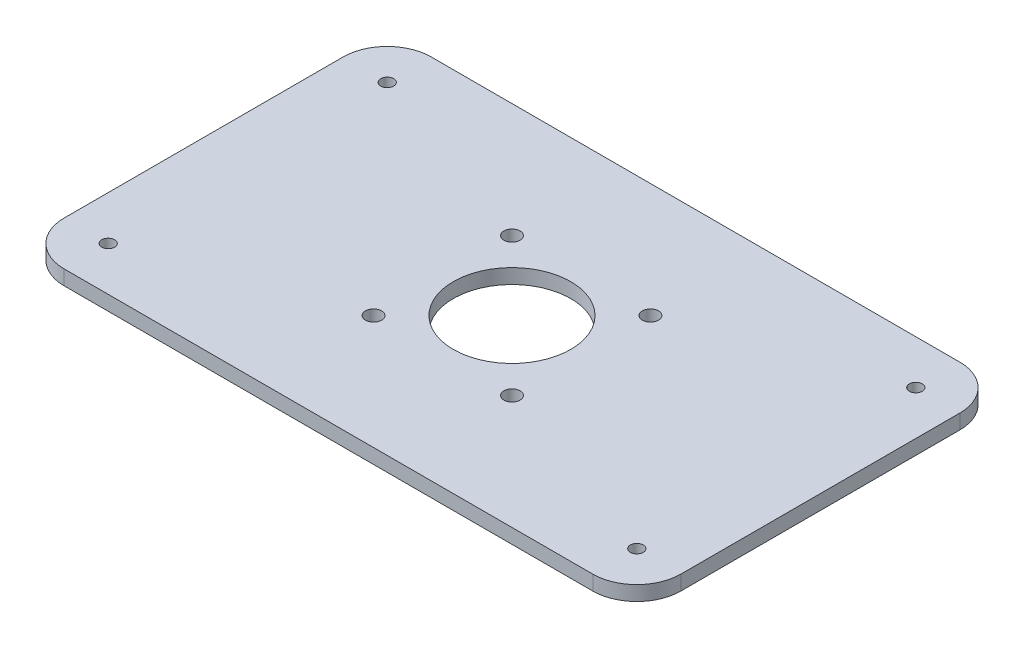
ISO-10303-21;
HEADER;
FILE_DESCRIPTION(('STEP AP214'),'2;1');
FILE_NAME('part.step','',(''),(''),'','','');
FILE_SCHEMA(('AUTOMOTIVE_DESIGN { 1 0 10303 214 1 1 1 1 }'));
ENDSEC;
DATA;
#1=APPLICATION_CONTEXT('core data for automotive mechanical design processes');
#2=APPLICATION_PROTOCOL_DEFINITION('international standard','automotive_design',2000,#1);
#3=PRODUCT_CONTEXT('',#1,'mechanical');
#4=PRODUCT('Part','Part','',(#3));
#5=PRODUCT_RELATED_PRODUCT_CATEGORY('part','',(#4));
#6=PRODUCT_DEFINITION_FORMATION('','',#4);
#7=PRODUCT_DEFINITION_CONTEXT('part definition',#1,'design');
#8=PRODUCT_DEFINITION('design','',#6,#7);
#9=PRODUCT_DEFINITION_SHAPE('','',#8);
#10=(LENGTH_UNIT() NAMED_UNIT(*) SI_UNIT(.MILLI.,.METRE.));
#11=(NAMED_UNIT(*) PLANE_ANGLE_UNIT() SI_UNIT($,.RADIAN.));
#12=(NAMED_UNIT(*) SI_UNIT($,.STERADIAN.) SOLID_ANGLE_UNIT());
#13=UNCERTAINTY_MEASURE_WITH_UNIT(LENGTH_MEASURE(1.E-05),#10,'distance_accuracy_value','');
#14=(GEOMETRIC_REPRESENTATION_CONTEXT(3) GLOBAL_UNCERTAINTY_ASSIGNED_CONTEXT((#13)) GLOBAL_UNIT_ASSIGNED_CONTEXT((#10,
#11,#12)) REPRESENTATION_CONTEXT('',''));
#15=CARTESIAN_POINT('',(0.,0.,0.));
#16=DIRECTION('',(0.,0.,1.));
#17=DIRECTION('',(1.,0.,0.));
#18=AXIS2_PLACEMENT_3D('',#15,#16,#17);
#19=CARTESIAN_POINT('',(0.,5.,0.));
#20=DIRECTION('',(0.,1.,0.));
#21=DIRECTION('',(0.,0.,1.));
#22=AXIS2_PLACEMENT_3D('',#19,#20,#21);
#23=PLANE('',#22);
#24=CARTESIAN_POINT('',(-23.5700000000002,5.,23.5699999999998));
#25=DIRECTION('',(0.,1.,0.));
#26=DIRECTION('',(0.,0.,1.));
#27=AXIS2_PLACEMENT_3D('',#24,#25,#26);
#28=CIRCLE('',#27,2.75);
#29=CARTESIAN_POINT('',(-23.5700000000002,5.,26.3199999999998));
#30=VERTEX_POINT('',#29);
#31=EDGE_CURVE('E320',#30,#30,#28,.T.);
#32=ORIENTED_EDGE('',*,*,#31,.F.);
#33=EDGE_LOOP('',(#32));
#34=FACE_BOUND('',#33,.T.);
#35=CARTESIAN_POINT('',(23.5699999999998,5.,23.5700000000002));
#36=DIRECTION('',(0.,1.,0.));
#37=DIRECTION('',(0.,0.,1.));
#38=AXIS2_PLACEMENT_3D('',#35,#36,#37);
#39=CIRCLE('',#38,2.75);
#40=CARTESIAN_POINT('',(23.5699999999998,5.,26.3200000000002));
#41=VERTEX_POINT('',#40);
#42=EDGE_CURVE('E323',#41,#41,#39,.T.);
#43=ORIENTED_EDGE('',*,*,#42,.F.);
#44=EDGE_LOOP('',(#43));
#45=FACE_BOUND('',#44,.T.);
#46=CARTESIAN_POINT('',(23.5700000000001,5.,-23.5699999999999));
#47=DIRECTION('',(0.,1.,0.));
#48=DIRECTION('',(0.,0.,1.));
#49=AXIS2_PLACEMENT_3D('',#46,#47,#48);
#50=CIRCLE('',#49,2.75);
#51=CARTESIAN_POINT('',(23.5700000000001,5.,-20.8199999999999));
#52=VERTEX_POINT('',#51);
#53=EDGE_CURVE('E289',#52,#52,#50,.T.);
#54=ORIENTED_EDGE('',*,*,#53,.F.);
#55=EDGE_LOOP('',(#54));
#56=FACE_BOUND('',#55,.T.);
#57=CARTESIAN_POINT('',(-23.57,5.,-23.57));
#58=DIRECTION('',(0.,1.,0.));
#59=DIRECTION('',(0.,0.,1.));
#60=AXIS2_PLACEMENT_3D('',#57,#58,#59);
#61=CIRCLE('',#60,2.75);
#62=CARTESIAN_POINT('',(-23.57,5.,-20.82));
#63=VERTEX_POINT('',#62);
#64=EDGE_CURVE('E175',#63,#63,#61,.T.);
#65=ORIENTED_EDGE('',*,*,#64,.F.);
#66=EDGE_LOOP('',(#65));
#67=FACE_BOUND('',#66,.T.);
#68=CARTESIAN_POINT('',(-90.,5.,47.5));
#69=DIRECTION('',(0.,1.,0.));
#70=DIRECTION('',(0.,0.,-1.));
#71=AXIS2_PLACEMENT_3D('',#68,#69,#70);
#72=CIRCLE('',#71,2.20000000000521);
#73=CARTESIAN_POINT('',(-90.,5.,45.2999999999948));
#74=VERTEX_POINT('',#73);
#75=EDGE_CURVE('E186',#74,#74,#72,.T.);
#76=ORIENTED_EDGE('',*,*,#75,.F.);
#77=EDGE_LOOP('',(#76));
#78=FACE_BOUND('',#77,.T.);
#79=CARTESIAN_POINT('',(90.0000000000001,5.,47.5));
#80=DIRECTION('',(0.,1.,0.));
#81=DIRECTION('',(0.,0.,1.));
#82=AXIS2_PLACEMENT_3D('',#79,#80,#81);
#83=CIRCLE('',#82,2.20000000000521);
#84=CARTESIAN_POINT('',(90.0000000000001,5.,49.7000000000053));
#85=VERTEX_POINT('',#84);
#86=EDGE_CURVE('E311',#85,#85,#83,.T.);
#87=ORIENTED_EDGE('',*,*,#86,.F.);
#88=EDGE_LOOP('',(#87));
#89=FACE_BOUND('',#88,.T.);
#90=CARTESIAN_POINT('',(90.0000000000001,5.,-47.5));
#91=DIRECTION('',(0.,1.,0.));
#92=DIRECTION('',(0.,0.,-1.));
#93=AXIS2_PLACEMENT_3D('',#90,#91,#92);
#94=CIRCLE('',#93,2.20000000000521);
#95=CARTESIAN_POINT('',(90.0000000000001,5.,-49.7000000000053));
#96=VERTEX_POINT('',#95);
#97=EDGE_CURVE('E200',#96,#96,#94,.T.);
#98=ORIENTED_EDGE('',*,*,#97,.F.);
#99=EDGE_LOOP('',(#98));
#100=FACE_BOUND('',#99,.T.);
#101=CARTESIAN_POINT('',(-90.,5.,-47.5));
#102=DIRECTION('',(0.,1.,0.));
#103=DIRECTION('',(0.,0.,1.));
#104=AXIS2_PLACEMENT_3D('',#101,#102,#103);
#105=CIRCLE('',#104,2.20000000000521);
#106=CARTESIAN_POINT('',(-90.,5.,-45.2999999999948));
#107=VERTEX_POINT('',#106);
#108=EDGE_CURVE('E197',#107,#107,#105,.T.);
#109=ORIENTED_EDGE('',*,*,#108,.F.);
#110=EDGE_LOOP('',(#109));
#111=FACE_BOUND('',#110,.T.);
#112=CARTESIAN_POINT('',(0.,5.,0.));
#113=DIRECTION('',(0.,1.,0.));
#114=DIRECTION('',(0.,0.,1.));
#115=AXIS2_PLACEMENT_3D('',#112,#113,#114);
#116=CIRCLE('',#115,20.);
#117=CARTESIAN_POINT('',(0.,5.,20.));
#118=VERTEX_POINT('',#117);
#119=EDGE_CURVE('E143',#118,#118,#116,.T.);
#120=ORIENTED_EDGE('',*,*,#119,.F.);
#121=EDGE_LOOP('',(#120));
#122=FACE_BOUND('',#121,.T.);
#123=DIRECTION('',(0.,0.,1.));
#124=VECTOR('',#123,1.);
#125=CARTESIAN_POINT('',(-105.,5.,-62.5));
#126=LINE('',#125,#124);
#127=CARTESIAN_POINT('',(-105.,5.,-47.5));
#128=VERTEX_POINT('',#127);
#129=CARTESIAN_POINT('',(-105.,5.,47.5));
#130=VERTEX_POINT('',#129);
#131=EDGE_CURVE('E142',#128,#130,#126,.T.);
#132=ORIENTED_EDGE('',*,*,#131,.T.);
#133=CARTESIAN_POINT('',(-90.,5.,47.5));
#134=DIRECTION('',(0.,1.,0.));
#135=DIRECTION('',(0.,0.,1.));
#136=AXIS2_PLACEMENT_3D('',#133,#134,#135);
#137=CIRCLE('',#136,15.);
#138=CARTESIAN_POINT('',(-90.,5.,62.5));
#139=VERTEX_POINT('',#138);
#140=EDGE_CURVE('E163',#130,#139,#137,.T.);
#141=ORIENTED_EDGE('',*,*,#140,.T.);
#142=DIRECTION('',(1.,0.,0.));
#143=VECTOR('',#142,1.);
#144=CARTESIAN_POINT('',(-105.,5.,62.5));
#145=LINE('',#144,#143);
#146=CARTESIAN_POINT('',(90.,5.,62.5));
#147=VERTEX_POINT('',#146);
#148=EDGE_CURVE('E125',#139,#147,#145,.T.);
#149=ORIENTED_EDGE('',*,*,#148,.T.);
#150=CARTESIAN_POINT('',(90.,5.,47.5));
#151=DIRECTION('',(0.,1.,0.));
#152=DIRECTION('',(0.,0.,1.));
#153=AXIS2_PLACEMENT_3D('',#150,#151,#152);
#154=CIRCLE('',#153,15.);
#155=CARTESIAN_POINT('',(105.,5.,47.5));
#156=VERTEX_POINT('',#155);
#157=EDGE_CURVE('E161',#147,#156,#154,.T.);
#158=ORIENTED_EDGE('',*,*,#157,.T.);
#159=DIRECTION('',(0.,0.,-1.));
#160=VECTOR('',#159,1.);
#161=CARTESIAN_POINT('',(105.,5.,-62.5));
#162=LINE('',#161,#160);
#163=CARTESIAN_POINT('',(105.,5.,-47.5));
#164=VERTEX_POINT('',#163);
#165=EDGE_CURVE('E204',#156,#164,#162,.T.);
#166=ORIENTED_EDGE('',*,*,#165,.T.);
#167=CARTESIAN_POINT('',(90.,5.,-47.5));
#168=DIRECTION('',(0.,1.,0.));
#169=DIRECTION('',(0.,0.,1.));
#170=AXIS2_PLACEMENT_3D('',#167,#168,#169);
#171=CIRCLE('',#170,15.);
#172=CARTESIAN_POINT('',(90.,5.,-62.5));
#173=VERTEX_POINT('',#172);
#174=EDGE_CURVE('E60',#164,#173,#171,.T.);
#175=ORIENTED_EDGE('',*,*,#174,.T.);
#176=DIRECTION('',(-1.,0.,0.));
#177=VECTOR('',#176,1.);
#178=CARTESIAN_POINT('',(-105.,5.,-62.5));
#179=LINE('',#178,#177);
#180=CARTESIAN_POINT('',(-90.,5.,-62.5));
#181=VERTEX_POINT('',#180);
#182=EDGE_CURVE('E149',#173,#181,#179,.T.);
#183=ORIENTED_EDGE('',*,*,#182,.T.);
#184=CARTESIAN_POINT('',(-90.,5.,-47.5));
#185=DIRECTION('',(0.,1.,0.));
#186=DIRECTION('',(0.,0.,1.));
#187=AXIS2_PLACEMENT_3D('',#184,#185,#186);
#188=CIRCLE('',#187,15.);
#189=EDGE_CURVE('E158',#181,#128,#188,.T.);
#190=ORIENTED_EDGE('',*,*,#189,.T.);
#191=EDGE_LOOP('',(#132,#141,#149,#158,#166,#175,#183,#190));
#192=FACE_BOUND('',#191,.T.);
#193=ADVANCED_FACE('F37',(#34,#45,#56,#67,#78,#89,#100,#111,#122,#192),#23,.T.);
#194=CARTESIAN_POINT('',(0.,0.,0.));
#195=DIRECTION('',(0.,1.,0.));
#196=DIRECTION('',(0.,0.,1.));
#197=AXIS2_PLACEMENT_3D('',#194,#195,#196);
#198=PLANE('',#197);
#199=CARTESIAN_POINT('',(-23.5700000000002,0.,23.5699999999998));
#200=DIRECTION('',(0.,1.,0.));
#201=DIRECTION('',(0.,0.,1.));
#202=AXIS2_PLACEMENT_3D('',#199,#200,#201);
#203=CIRCLE('',#202,2.75);
#204=CARTESIAN_POINT('',(-23.5700000000002,0.,26.3199999999998));
#205=VERTEX_POINT('',#204);
#206=EDGE_CURVE('E41',#205,#205,#203,.T.);
#207=ORIENTED_EDGE('',*,*,#206,.T.);
#208=EDGE_LOOP('',(#207));
#209=FACE_BOUND('',#208,.T.);
#210=CARTESIAN_POINT('',(23.5699999999998,0.,23.5700000000002));
#211=DIRECTION('',(0.,1.,0.));
#212=DIRECTION('',(0.,0.,1.));
#213=AXIS2_PLACEMENT_3D('',#210,#211,#212);
#214=CIRCLE('',#213,2.75);
#215=CARTESIAN_POINT('',(23.5699999999998,0.,26.3200000000002));
#216=VERTEX_POINT('',#215);
#217=EDGE_CURVE('E177',#216,#216,#214,.T.);
#218=ORIENTED_EDGE('',*,*,#217,.T.);
#219=EDGE_LOOP('',(#218));
#220=FACE_BOUND('',#219,.T.);
#221=CARTESIAN_POINT('',(23.5700000000001,0.,-23.5699999999999));
#222=DIRECTION('',(0.,1.,0.));
#223=DIRECTION('',(0.,0.,1.));
#224=AXIS2_PLACEMENT_3D('',#221,#222,#223);
#225=CIRCLE('',#224,2.75);
#226=CARTESIAN_POINT('',(23.5700000000001,0.,-20.8199999999999));
#227=VERTEX_POINT('',#226);
#228=EDGE_CURVE('E174',#227,#227,#225,.T.);
#229=ORIENTED_EDGE('',*,*,#228,.T.);
#230=EDGE_LOOP('',(#229));
#231=FACE_BOUND('',#230,.T.);
#232=CARTESIAN_POINT('',(-23.57,0.,-23.57));
#233=DIRECTION('',(0.,1.,0.));
#234=DIRECTION('',(0.,0.,1.));
#235=AXIS2_PLACEMENT_3D('',#232,#233,#234);
#236=CIRCLE('',#235,2.75);
#237=CARTESIAN_POINT('',(-23.57,0.,-20.82));
#238=VERTEX_POINT('',#237);
#239=EDGE_CURVE('E171',#238,#238,#236,.T.);
#240=ORIENTED_EDGE('',*,*,#239,.T.);
#241=EDGE_LOOP('',(#240));
#242=FACE_BOUND('',#241,.T.);
#243=CARTESIAN_POINT('',(-90.,0.,47.5));
#244=DIRECTION('',(0.,1.,0.));
#245=DIRECTION('',(0.,0.,-1.));
#246=AXIS2_PLACEMENT_3D('',#243,#244,#245);
#247=CIRCLE('',#246,2.20000000000521);
#248=CARTESIAN_POINT('',(-90.,0.,45.2999999999948));
#249=VERTEX_POINT('',#248);
#250=EDGE_CURVE('E182',#249,#249,#247,.T.);
#251=ORIENTED_EDGE('',*,*,#250,.T.);
#252=EDGE_LOOP('',(#251));
#253=FACE_BOUND('',#252,.T.);
#254=CARTESIAN_POINT('',(90.0000000000001,0.,47.5));
#255=DIRECTION('',(0.,1.,0.));
#256=DIRECTION('',(0.,0.,1.));
#257=AXIS2_PLACEMENT_3D('',#254,#255,#256);
#258=CIRCLE('',#257,2.20000000000521);
#259=CARTESIAN_POINT('',(90.0000000000001,0.,49.7000000000053));
#260=VERTEX_POINT('',#259);
#261=EDGE_CURVE('E191',#260,#260,#258,.T.);
#262=ORIENTED_EDGE('',*,*,#261,.T.);
#263=EDGE_LOOP('',(#262));
#264=FACE_BOUND('',#263,.T.);
#265=CARTESIAN_POINT('',(90.0000000000001,0.,-47.5));
#266=DIRECTION('',(0.,1.,0.));
#267=DIRECTION('',(0.,0.,-1.));
#268=AXIS2_PLACEMENT_3D('',#265,#266,#267);
#269=CIRCLE('',#268,2.20000000000521);
#270=CARTESIAN_POINT('',(90.0000000000001,0.,-49.7000000000053));
#271=VERTEX_POINT('',#270);
#272=EDGE_CURVE('E301',#271,#271,#269,.T.);
#273=ORIENTED_EDGE('',*,*,#272,.T.);
#274=EDGE_LOOP('',(#273));
#275=FACE_BOUND('',#274,.T.);
#276=CARTESIAN_POINT('',(-90.,0.,-47.5));
#277=DIRECTION('',(0.,1.,0.));
#278=DIRECTION('',(0.,0.,1.));
#279=AXIS2_PLACEMENT_3D('',#276,#277,#278);
#280=CIRCLE('',#279,2.20000000000521);
#281=CARTESIAN_POINT('',(-90.,0.,-45.2999999999948));
#282=VERTEX_POINT('',#281);
#283=EDGE_CURVE('E137',#282,#282,#280,.T.);
#284=ORIENTED_EDGE('',*,*,#283,.T.);
#285=EDGE_LOOP('',(#284));
#286=FACE_BOUND('',#285,.T.);
#287=CARTESIAN_POINT('',(0.,0.,0.));
#288=DIRECTION('',(0.,1.,0.));
#289=DIRECTION('',(0.,0.,1.));
#290=AXIS2_PLACEMENT_3D('',#287,#288,#289);
#291=CIRCLE('',#290,20.);
#292=CARTESIAN_POINT('',(0.,0.,20.));
#293=VERTEX_POINT('',#292);
#294=EDGE_CURVE('E146',#293,#293,#291,.T.);
#295=ORIENTED_EDGE('',*,*,#294,.T.);
#296=EDGE_LOOP('',(#295));
#297=FACE_BOUND('',#296,.T.);
#298=DIRECTION('',(1.,0.,0.));
#299=VECTOR('',#298,1.);
#300=CARTESIAN_POINT('',(-105.,0.,62.5));
#301=LINE('',#300,#299);
#302=CARTESIAN_POINT('',(-90.,0.,62.5));
#303=VERTEX_POINT('',#302);
#304=CARTESIAN_POINT('',(90.,0.,62.5));
#305=VERTEX_POINT('',#304);
#306=EDGE_CURVE('E122',#303,#305,#301,.T.);
#307=ORIENTED_EDGE('',*,*,#306,.F.);
#308=CARTESIAN_POINT('',(-90.,0.,47.5));
#309=DIRECTION('',(0.,1.,0.));
#310=DIRECTION('',(0.,0.,1.));
#311=AXIS2_PLACEMENT_3D('',#308,#309,#310);
#312=CIRCLE('',#311,15.);
#313=CARTESIAN_POINT('',(-105.,0.,47.5));
#314=VERTEX_POINT('',#313);
#315=EDGE_CURVE('E105',#303,#314,#312,.F.);
#316=ORIENTED_EDGE('',*,*,#315,.T.);
#317=DIRECTION('',(0.,0.,1.));
#318=VECTOR('',#317,1.);
#319=CARTESIAN_POINT('',(-105.,0.,-62.5));
#320=LINE('',#319,#318);
#321=CARTESIAN_POINT('',(-105.,0.,-47.5));
#322=VERTEX_POINT('',#321);
#323=EDGE_CURVE('E132',#322,#314,#320,.T.);
#324=ORIENTED_EDGE('',*,*,#323,.F.);
#325=CARTESIAN_POINT('',(-90.,0.,-47.5));
#326=DIRECTION('',(0.,1.,0.));
#327=DIRECTION('',(0.,0.,1.));
#328=AXIS2_PLACEMENT_3D('',#325,#326,#327);
#329=CIRCLE('',#328,15.);
#330=CARTESIAN_POINT('',(-90.,0.,-62.5));
#331=VERTEX_POINT('',#330);
#332=EDGE_CURVE('E126',#322,#331,#329,.F.);
#333=ORIENTED_EDGE('',*,*,#332,.T.);
#334=DIRECTION('',(-1.,0.,0.));
#335=VECTOR('',#334,1.);
#336=CARTESIAN_POINT('',(-105.,0.,-62.5));
#337=LINE('',#336,#335);
#338=CARTESIAN_POINT('',(90.,0.,-62.5));
#339=VERTEX_POINT('',#338);
#340=EDGE_CURVE('E135',#339,#331,#337,.T.);
#341=ORIENTED_EDGE('',*,*,#340,.F.);
#342=CARTESIAN_POINT('',(90.,0.,-47.5));
#343=DIRECTION('',(0.,1.,0.));
#344=DIRECTION('',(0.,0.,1.));
#345=AXIS2_PLACEMENT_3D('',#342,#343,#344);
#346=CIRCLE('',#345,15.);
#347=CARTESIAN_POINT('',(105.,0.,-47.5));
#348=VERTEX_POINT('',#347);
#349=EDGE_CURVE('E152',#339,#348,#346,.F.);
#350=ORIENTED_EDGE('',*,*,#349,.T.);
#351=DIRECTION('',(0.,0.,-1.));
#352=VECTOR('',#351,1.);
#353=CARTESIAN_POINT('',(105.,0.,-62.5));
#354=LINE('',#353,#352);
#355=CARTESIAN_POINT('',(105.,0.,47.5));
#356=VERTEX_POINT('',#355);
#357=EDGE_CURVE('E131',#356,#348,#354,.T.);
#358=ORIENTED_EDGE('',*,*,#357,.F.);
#359=CARTESIAN_POINT('',(90.,0.,47.5));
#360=DIRECTION('',(0.,1.,0.));
#361=DIRECTION('',(0.,0.,1.));
#362=AXIS2_PLACEMENT_3D('',#359,#360,#361);
#363=CIRCLE('',#362,15.);
#364=EDGE_CURVE('E116',#356,#305,#363,.F.);
#365=ORIENTED_EDGE('',*,*,#364,.T.);
#366=EDGE_LOOP('',(#307,#316,#324,#333,#341,#350,#358,#365));
#367=FACE_BOUND('',#366,.T.);
#368=ADVANCED_FACE('F129',(#209,#220,#231,#242,#253,#264,#275,#286,#297,#367),#198,.F.);
#369=CARTESIAN_POINT('',(0.,5.,0.));
#370=DIRECTION('',(0.,-1.,0.));
#371=DIRECTION('',(0.,0.,-1.));
#372=AXIS2_PLACEMENT_3D('',#369,#370,#371);
#373=CYLINDRICAL_SURFACE('',#372,20.);
#374=ORIENTED_EDGE('',*,*,#119,.T.);
#375=EDGE_LOOP('',(#374));
#376=FACE_BOUND('',#375,.T.);
#377=ORIENTED_EDGE('',*,*,#294,.F.);
#378=EDGE_LOOP('',(#377));
#379=FACE_BOUND('',#378,.T.);
#380=ADVANCED_FACE('F239',(#376,#379),#373,.F.);
#381=CARTESIAN_POINT('',(-105.,5.,-62.5));
#382=DIRECTION('',(1.,0.,0.));
#383=DIRECTION('',(0.,0.,-1.));
#384=AXIS2_PLACEMENT_3D('',#381,#382,#383);
#385=PLANE('',#384);
#386=ORIENTED_EDGE('',*,*,#323,.T.);
#387=DIRECTION('',(0.,-1.,0.));
#388=VECTOR('',#387,1.);
#389=CARTESIAN_POINT('',(-105.,5.,47.5));
#390=LINE('',#389,#388);
#391=EDGE_CURVE('E110',#314,#130,#390,.F.);
#392=ORIENTED_EDGE('',*,*,#391,.T.);
#393=ORIENTED_EDGE('',*,*,#131,.F.);
#394=DIRECTION('',(0.,-1.,0.));
#395=VECTOR('',#394,1.);
#396=CARTESIAN_POINT('',(-105.,5.,-47.5));
#397=LINE('',#396,#395);
#398=EDGE_CURVE('E115',#128,#322,#397,.T.);
#399=ORIENTED_EDGE('',*,*,#398,.T.);
#400=EDGE_LOOP('',(#386,#392,#393,#399));
#401=FACE_BOUND('',#400,.T.);
#402=ADVANCED_FACE('F211',(#401),#385,.F.);
#403=CARTESIAN_POINT('',(-105.,5.,62.5));
#404=DIRECTION('',(0.,0.,-1.));
#405=DIRECTION('',(-1.,0.,0.));
#406=AXIS2_PLACEMENT_3D('',#403,#404,#405);
#407=PLANE('',#406);
#408=ORIENTED_EDGE('',*,*,#148,.F.);
#409=DIRECTION('',(0.,-1.,0.));
#410=VECTOR('',#409,1.);
#411=CARTESIAN_POINT('',(-90.,5.,62.5));
#412=LINE('',#411,#410);
#413=EDGE_CURVE('E109',#139,#303,#412,.T.);
#414=ORIENTED_EDGE('',*,*,#413,.T.);
#415=ORIENTED_EDGE('',*,*,#306,.T.);
#416=DIRECTION('',(0.,-1.,0.));
#417=VECTOR('',#416,1.);
#418=CARTESIAN_POINT('',(90.,5.,62.5));
#419=LINE('',#418,#417);
#420=EDGE_CURVE('E127',#305,#147,#419,.F.);
#421=ORIENTED_EDGE('',*,*,#420,.T.);
#422=EDGE_LOOP('',(#408,#414,#415,#421));
#423=FACE_BOUND('',#422,.T.);
#424=ADVANCED_FACE('F121',(#423),#407,.F.);
#425=CARTESIAN_POINT('',(105.,5.,-62.5));
#426=DIRECTION('',(-1.,0.,0.));
#427=DIRECTION('',(0.,0.,1.));
#428=AXIS2_PLACEMENT_3D('',#425,#426,#427);
#429=PLANE('',#428);
#430=ORIENTED_EDGE('',*,*,#165,.F.);
#431=DIRECTION('',(0.,-1.,0.));
#432=VECTOR('',#431,1.);
#433=CARTESIAN_POINT('',(105.,5.,47.5));
#434=LINE('',#433,#432);
#435=EDGE_CURVE('E167',#156,#356,#434,.T.);
#436=ORIENTED_EDGE('',*,*,#435,.T.);
#437=ORIENTED_EDGE('',*,*,#357,.T.);
#438=DIRECTION('',(0.,-1.,0.));
#439=VECTOR('',#438,1.);
#440=CARTESIAN_POINT('',(105.,5.,-47.5));
#441=LINE('',#440,#439);
#442=EDGE_CURVE('E165',#348,#164,#441,.F.);
#443=ORIENTED_EDGE('',*,*,#442,.T.);
#444=EDGE_LOOP('',(#430,#436,#437,#443));
#445=FACE_BOUND('',#444,.T.);
#446=ADVANCED_FACE('F219',(#445),#429,.F.);
#447=CARTESIAN_POINT('',(-105.,5.,-62.5));
#448=DIRECTION('',(0.,0.,1.));
#449=DIRECTION('',(1.,0.,0.));
#450=AXIS2_PLACEMENT_3D('',#447,#448,#449);
#451=PLANE('',#450);
#452=ORIENTED_EDGE('',*,*,#182,.F.);
#453=DIRECTION('',(0.,-1.,0.));
#454=VECTOR('',#453,1.);
#455=CARTESIAN_POINT('',(90.,5.,-62.5));
#456=LINE('',#455,#454);
#457=EDGE_CURVE('E11',#173,#339,#456,.T.);
#458=ORIENTED_EDGE('',*,*,#457,.T.);
#459=ORIENTED_EDGE('',*,*,#340,.T.);
#460=DIRECTION('',(0.,-1.,0.));
#461=VECTOR('',#460,1.);
#462=CARTESIAN_POINT('',(-90.,5.,-62.5));
#463=LINE('',#462,#461);
#464=EDGE_CURVE('E46',#331,#181,#463,.F.);
#465=ORIENTED_EDGE('',*,*,#464,.T.);
#466=EDGE_LOOP('',(#452,#458,#459,#465));
#467=FACE_BOUND('',#466,.T.);
#468=ADVANCED_FACE('F213',(#467),#451,.F.);
#469=CARTESIAN_POINT('',(-90.,0.,-47.5));
#470=DIRECTION('',(0.,1.,0.));
#471=DIRECTION('',(0.,0.,1.));
#472=AXIS2_PLACEMENT_3D('',#469,#470,#471);
#473=CYLINDRICAL_SURFACE('',#472,2.20000000000521);
#474=ORIENTED_EDGE('',*,*,#283,.F.);
#475=EDGE_LOOP('',(#474));
#476=FACE_BOUND('',#475,.T.);
#477=ORIENTED_EDGE('',*,*,#108,.T.);
#478=EDGE_LOOP('',(#477));
#479=FACE_BOUND('',#478,.T.);
#480=ADVANCED_FACE('F254',(#476,#479),#473,.F.);
#481=CARTESIAN_POINT('',(90.0000000000001,0.,-47.5));
#482=DIRECTION('',(0.,1.,0.));
#483=DIRECTION('',(0.,0.,1.));
#484=AXIS2_PLACEMENT_3D('',#481,#482,#483);
#485=CYLINDRICAL_SURFACE('',#484,2.20000000000521);
#486=ORIENTED_EDGE('',*,*,#272,.F.);
#487=EDGE_LOOP('',(#486));
#488=FACE_BOUND('',#487,.T.);
#489=ORIENTED_EDGE('',*,*,#97,.T.);
#490=EDGE_LOOP('',(#489));
#491=FACE_BOUND('',#490,.T.);
#492=ADVANCED_FACE('F257',(#488,#491),#485,.F.);
#493=CARTESIAN_POINT('',(90.0000000000001,0.,47.5));
#494=DIRECTION('',(0.,1.,0.));
#495=DIRECTION('',(0.,0.,1.));
#496=AXIS2_PLACEMENT_3D('',#493,#494,#495);
#497=CYLINDRICAL_SURFACE('',#496,2.20000000000521);
#498=ORIENTED_EDGE('',*,*,#261,.F.);
#499=EDGE_LOOP('',(#498));
#500=FACE_BOUND('',#499,.T.);
#501=ORIENTED_EDGE('',*,*,#86,.T.);
#502=EDGE_LOOP('',(#501));
#503=FACE_BOUND('',#502,.T.);
#504=ADVANCED_FACE('F261',(#500,#503),#497,.F.);
#505=CARTESIAN_POINT('',(-90.,0.,47.5));
#506=DIRECTION('',(0.,1.,0.));
#507=DIRECTION('',(0.,0.,1.));
#508=AXIS2_PLACEMENT_3D('',#505,#506,#507);
#509=CYLINDRICAL_SURFACE('',#508,2.20000000000521);
#510=ORIENTED_EDGE('',*,*,#250,.F.);
#511=EDGE_LOOP('',(#510));
#512=FACE_BOUND('',#511,.T.);
#513=ORIENTED_EDGE('',*,*,#75,.T.);
#514=EDGE_LOOP('',(#513));
#515=FACE_BOUND('',#514,.T.);
#516=ADVANCED_FACE('F230',(#512,#515),#509,.F.);
#517=CARTESIAN_POINT('',(-90.,5.,47.5));
#518=DIRECTION('',(0.,-1.,0.));
#519=DIRECTION('',(0.,0.,-1.));
#520=AXIS2_PLACEMENT_3D('',#517,#518,#519);
#521=CYLINDRICAL_SURFACE('',#520,15.);
#522=ORIENTED_EDGE('',*,*,#140,.F.);
#523=ORIENTED_EDGE('',*,*,#391,.F.);
#524=ORIENTED_EDGE('',*,*,#315,.F.);
#525=ORIENTED_EDGE('',*,*,#413,.F.);
#526=EDGE_LOOP('',(#522,#523,#524,#525));
#527=FACE_BOUND('',#526,.T.);
#528=ADVANCED_FACE('F108',(#527),#521,.T.);
#529=CARTESIAN_POINT('',(90.,5.,47.5));
#530=DIRECTION('',(0.,-1.,0.));
#531=DIRECTION('',(0.,0.,-1.));
#532=AXIS2_PLACEMENT_3D('',#529,#530,#531);
#533=CYLINDRICAL_SURFACE('',#532,15.);
#534=ORIENTED_EDGE('',*,*,#157,.F.);
#535=ORIENTED_EDGE('',*,*,#420,.F.);
#536=ORIENTED_EDGE('',*,*,#364,.F.);
#537=ORIENTED_EDGE('',*,*,#435,.F.);
#538=EDGE_LOOP('',(#534,#535,#536,#537));
#539=FACE_BOUND('',#538,.T.);
#540=ADVANCED_FACE('F223',(#539),#533,.T.);
#541=CARTESIAN_POINT('',(90.,5.,-47.5));
#542=DIRECTION('',(0.,-1.,0.));
#543=DIRECTION('',(0.,0.,-1.));
#544=AXIS2_PLACEMENT_3D('',#541,#542,#543);
#545=CYLINDRICAL_SURFACE('',#544,15.);
#546=ORIENTED_EDGE('',*,*,#174,.F.);
#547=ORIENTED_EDGE('',*,*,#442,.F.);
#548=ORIENTED_EDGE('',*,*,#349,.F.);
#549=ORIENTED_EDGE('',*,*,#457,.F.);
#550=EDGE_LOOP('',(#546,#547,#548,#549));
#551=FACE_BOUND('',#550,.T.);
#552=ADVANCED_FACE('F215',(#551),#545,.T.);
#553=CARTESIAN_POINT('',(-90.,5.,-47.5));
#554=DIRECTION('',(0.,-1.,0.));
#555=DIRECTION('',(0.,0.,-1.));
#556=AXIS2_PLACEMENT_3D('',#553,#554,#555);
#557=CYLINDRICAL_SURFACE('',#556,15.);
#558=ORIENTED_EDGE('',*,*,#189,.F.);
#559=ORIENTED_EDGE('',*,*,#464,.F.);
#560=ORIENTED_EDGE('',*,*,#332,.F.);
#561=ORIENTED_EDGE('',*,*,#398,.F.);
#562=EDGE_LOOP('',(#558,#559,#560,#561));
#563=FACE_BOUND('',#562,.T.);
#564=ADVANCED_FACE('F39',(#563),#557,.T.);
#565=CARTESIAN_POINT('',(-23.57,-5.,-23.57));
#566=DIRECTION('',(0.,1.,0.));
#567=DIRECTION('',(0.,0.,1.));
#568=AXIS2_PLACEMENT_3D('',#565,#566,#567);
#569=CYLINDRICAL_SURFACE('',#568,2.75);
#570=ORIENTED_EDGE('',*,*,#64,.T.);
#571=EDGE_LOOP('',(#570));
#572=FACE_BOUND('',#571,.T.);
#573=ORIENTED_EDGE('',*,*,#239,.F.);
#574=EDGE_LOOP('',(#573));
#575=FACE_BOUND('',#574,.T.);
#576=ADVANCED_FACE('F269',(#572,#575),#569,.F.);
#577=CARTESIAN_POINT('',(23.5700000000001,-5.,-23.5699999999999));
#578=DIRECTION('',(0.,1.,0.));
#579=DIRECTION('',(0.,0.,1.));
#580=AXIS2_PLACEMENT_3D('',#577,#578,#579);
#581=CYLINDRICAL_SURFACE('',#580,2.75);
#582=ORIENTED_EDGE('',*,*,#53,.T.);
#583=EDGE_LOOP('',(#582));
#584=FACE_BOUND('',#583,.T.);
#585=ORIENTED_EDGE('',*,*,#228,.F.);
#586=EDGE_LOOP('',(#585));
#587=FACE_BOUND('',#586,.T.);
#588=ADVANCED_FACE('F272',(#584,#587),#581,.F.);
#589=CARTESIAN_POINT('',(23.5699999999998,-5.,23.5700000000002));
#590=DIRECTION('',(0.,1.,0.));
#591=DIRECTION('',(0.,0.,1.));
#592=AXIS2_PLACEMENT_3D('',#589,#590,#591);
#593=CYLINDRICAL_SURFACE('',#592,2.75);
#594=ORIENTED_EDGE('',*,*,#42,.T.);
#595=EDGE_LOOP('',(#594));
#596=FACE_BOUND('',#595,.T.);
#597=ORIENTED_EDGE('',*,*,#217,.F.);
#598=EDGE_LOOP('',(#597));
#599=FACE_BOUND('',#598,.T.);
#600=ADVANCED_FACE('F277',(#596,#599),#593,.F.);
#601=CARTESIAN_POINT('',(-23.5700000000002,-5.,23.5699999999998));
#602=DIRECTION('',(0.,1.,0.));
#603=DIRECTION('',(0.,0.,1.));
#604=AXIS2_PLACEMENT_3D('',#601,#602,#603);
#605=CYLINDRICAL_SURFACE('',#604,2.75);
#606=ORIENTED_EDGE('',*,*,#31,.T.);
#607=EDGE_LOOP('',(#606));
#608=FACE_BOUND('',#607,.T.);
#609=ORIENTED_EDGE('',*,*,#206,.F.);
#610=EDGE_LOOP('',(#609));
#611=FACE_BOUND('',#610,.T.);
#612=ADVANCED_FACE('F274',(#608,#611),#605,.F.);
#613=CLOSED_SHELL('',(#193,#368,#380,#402,#424,#446,#468,#480,#492,#504,#516,#528,#540,#552,
#564,#576,#588,#600,#612));
#614=MANIFOLD_SOLID_BREP('B2',#613);
#615=ADVANCED_BREP_SHAPE_REPRESENTATION('',(#18,#614),#14);
#616=SHAPE_DEFINITION_REPRESENTATION(#9,#615);
ENDSEC;
END-ISO-10303-21;
